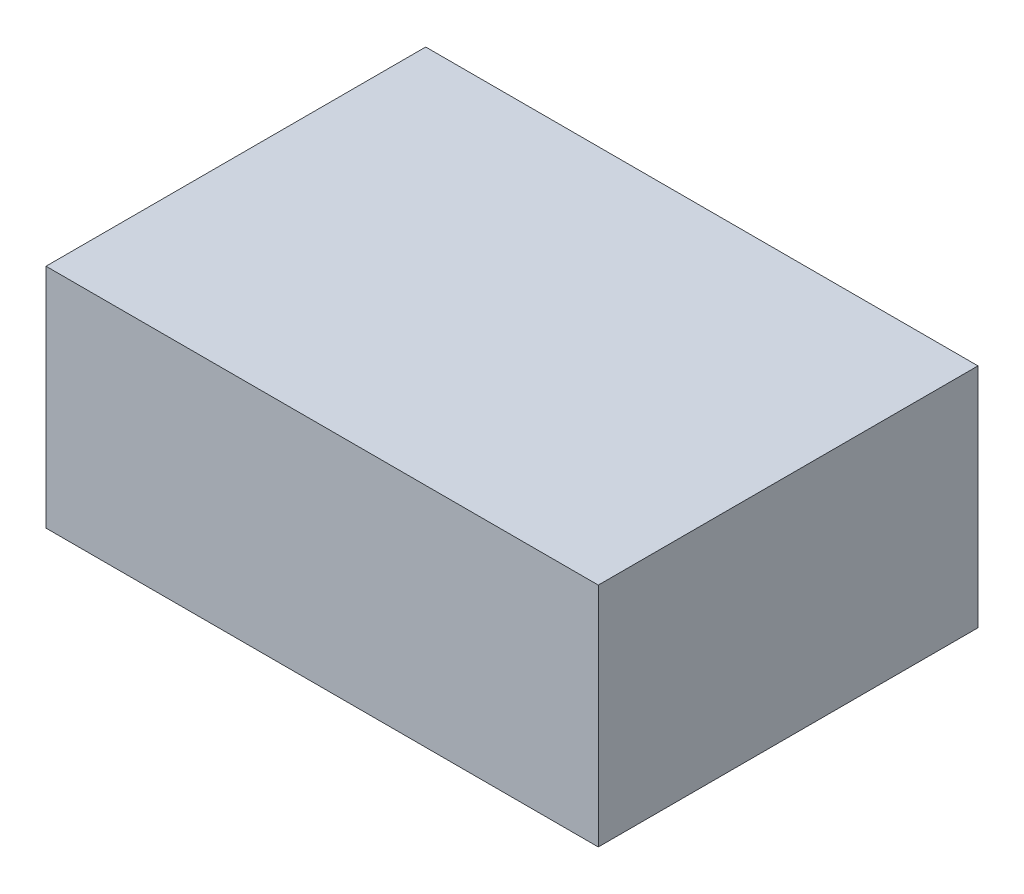
ISO-10303-21;
HEADER;
FILE_DESCRIPTION(('STEP AP214'),'2;1');
FILE_NAME('part.step','',(''),(''),'','','');
FILE_SCHEMA(('AUTOMOTIVE_DESIGN { 1 0 10303 214 1 1 1 1 }'));
ENDSEC;
DATA;
#1=APPLICATION_CONTEXT('core data for automotive mechanical design processes');
#2=APPLICATION_PROTOCOL_DEFINITION('international standard','automotive_design',2000,#1);
#3=PRODUCT_CONTEXT('',#1,'mechanical');
#4=PRODUCT('Part','Part','',(#3));
#5=PRODUCT_RELATED_PRODUCT_CATEGORY('part','',(#4));
#6=PRODUCT_DEFINITION_FORMATION('','',#4);
#7=PRODUCT_DEFINITION_CONTEXT('part definition',#1,'design');
#8=PRODUCT_DEFINITION('design','',#6,#7);
#9=PRODUCT_DEFINITION_SHAPE('','',#8);
#10=(LENGTH_UNIT() NAMED_UNIT(*) SI_UNIT(.MILLI.,.METRE.));
#11=(NAMED_UNIT(*) PLANE_ANGLE_UNIT() SI_UNIT($,.RADIAN.));
#12=(NAMED_UNIT(*) SI_UNIT($,.STERADIAN.) SOLID_ANGLE_UNIT());
#13=UNCERTAINTY_MEASURE_WITH_UNIT(LENGTH_MEASURE(1.E-05),#10,'distance_accuracy_value','');
#14=(GEOMETRIC_REPRESENTATION_CONTEXT(3) GLOBAL_UNCERTAINTY_ASSIGNED_CONTEXT((#13)) GLOBAL_UNIT_ASSIGNED_CONTEXT((#10,
#11,#12)) REPRESENTATION_CONTEXT('',''));
#15=CARTESIAN_POINT('',(0.,0.,0.));
#16=DIRECTION('',(0.,0.,1.));
#17=DIRECTION('',(1.,0.,0.));
#18=AXIS2_PLACEMENT_3D('',#15,#16,#17);
#19=CARTESIAN_POINT('',(1.17,0.22,-1.98078486941323));
#20=DIRECTION('',(0.,1.,0.));
#21=DIRECTION('',(0.,0.,1.));
#22=AXIS2_PLACEMENT_3D('',#19,#20,#21);
#23=PLANE('',#22);
#24=DIRECTION('',(1.,0.,0.));
#25=VECTOR('',#24,1.);
#26=CARTESIAN_POINT('',(1.17,0.22,-0.77));
#27=LINE('',#26,#25);
#28=CARTESIAN_POINT('',(0.0499999999999999,0.22,-0.77));
#29=VERTEX_POINT('',#28);
#30=CARTESIAN_POINT('',(1.17,0.22,-0.77));
#31=VERTEX_POINT('',#30);
#32=EDGE_CURVE('E41',#29,#31,#27,.T.);
#33=ORIENTED_EDGE('',*,*,#32,.F.);
#34=DIRECTION('',(0.,0.,1.));
#35=VECTOR('',#34,1.);
#36=CARTESIAN_POINT('',(0.0499999999999999,0.22,-1.98078486941323));
#37=LINE('',#36,#35);
#38=CARTESIAN_POINT('',(0.0499999999999999,0.22,0.));
#39=VERTEX_POINT('',#38);
#40=EDGE_CURVE('E69',#29,#39,#37,.T.);
#41=ORIENTED_EDGE('',*,*,#40,.T.);
#42=DIRECTION('',(-1.,0.,0.));
#43=VECTOR('',#42,1.);
#44=CARTESIAN_POINT('',(1.17,0.22,0.));
#45=LINE('',#44,#43);
#46=CARTESIAN_POINT('',(1.17,0.22,0.));
#47=VERTEX_POINT('',#46);
#48=EDGE_CURVE('E73',#47,#39,#45,.T.);
#49=ORIENTED_EDGE('',*,*,#48,.F.);
#50=DIRECTION('',(0.,0.,1.));
#51=VECTOR('',#50,1.);
#52=CARTESIAN_POINT('',(1.17,0.22,-1.98078486941323));
#53=LINE('',#52,#51);
#54=EDGE_CURVE('E96',#31,#47,#53,.T.);
#55=ORIENTED_EDGE('',*,*,#54,.F.);
#56=EDGE_LOOP('',(#33,#41,#49,#55));
#57=FACE_BOUND('',#56,.T.);
#58=ADVANCED_FACE('F33',(#57),#23,.T.);
#59=CARTESIAN_POINT('',(1.17,-0.24,-1.98078486941323));
#60=DIRECTION('',(1.,0.,0.));
#61=DIRECTION('',(0.,0.,-1.));
#62=AXIS2_PLACEMENT_3D('',#59,#60,#61);
#63=PLANE('',#62);
#64=DIRECTION('',(0.,-1.,0.));
#65=VECTOR('',#64,1.);
#66=CARTESIAN_POINT('',(1.17,-0.24,-0.77));
#67=LINE('',#66,#65);
#68=CARTESIAN_POINT('',(1.17,-0.24,-0.77));
#69=VERTEX_POINT('',#68);
#70=EDGE_CURVE('E47',#31,#69,#67,.T.);
#71=ORIENTED_EDGE('',*,*,#70,.F.);
#72=ORIENTED_EDGE('',*,*,#54,.T.);
#73=DIRECTION('',(0.,1.,0.));
#74=VECTOR('',#73,1.);
#75=CARTESIAN_POINT('',(1.17,-0.24,0.));
#76=LINE('',#75,#74);
#77=CARTESIAN_POINT('',(1.17,-0.24,0.));
#78=VERTEX_POINT('',#77);
#79=EDGE_CURVE('E78',#78,#47,#76,.T.);
#80=ORIENTED_EDGE('',*,*,#79,.F.);
#81=DIRECTION('',(0.,0.,1.));
#82=VECTOR('',#81,1.);
#83=CARTESIAN_POINT('',(1.17,-0.24,-1.98078486941323));
#84=LINE('',#83,#82);
#85=EDGE_CURVE('E99',#69,#78,#84,.T.);
#86=ORIENTED_EDGE('',*,*,#85,.F.);
#87=EDGE_LOOP('',(#71,#72,#80,#86));
#88=FACE_BOUND('',#87,.T.);
#89=ADVANCED_FACE('F105',(#88),#63,.T.);
#90=CARTESIAN_POINT('',(0.0499999999999999,-0.24,-1.98078486941323));
#91=DIRECTION('',(0.,-1.,0.));
#92=DIRECTION('',(0.,0.,-1.));
#93=AXIS2_PLACEMENT_3D('',#90,#91,#92);
#94=PLANE('',#93);
#95=DIRECTION('',(-1.,0.,0.));
#96=VECTOR('',#95,1.);
#97=CARTESIAN_POINT('',(0.0499999999999999,-0.24,-0.77));
#98=LINE('',#97,#96);
#99=CARTESIAN_POINT('',(0.0499999999999999,-0.24,-0.77));
#100=VERTEX_POINT('',#99);
#101=EDGE_CURVE('E98',#69,#100,#98,.T.);
#102=ORIENTED_EDGE('',*,*,#101,.F.);
#103=ORIENTED_EDGE('',*,*,#85,.T.);
#104=DIRECTION('',(1.,0.,0.));
#105=VECTOR('',#104,1.);
#106=CARTESIAN_POINT('',(0.0499999999999999,-0.24,0.));
#107=LINE('',#106,#105);
#108=CARTESIAN_POINT('',(0.0499999999999999,-0.24,0.));
#109=VERTEX_POINT('',#108);
#110=EDGE_CURVE('E86',#109,#78,#107,.T.);
#111=ORIENTED_EDGE('',*,*,#110,.F.);
#112=DIRECTION('',(0.,0.,1.));
#113=VECTOR('',#112,1.);
#114=CARTESIAN_POINT('',(0.0499999999999999,-0.24,-1.98078486941323));
#115=LINE('',#114,#113);
#116=EDGE_CURVE('E77',#100,#109,#115,.T.);
#117=ORIENTED_EDGE('',*,*,#116,.F.);
#118=EDGE_LOOP('',(#102,#103,#111,#117));
#119=FACE_BOUND('',#118,.T.);
#120=ADVANCED_FACE('F103',(#119),#94,.T.);
#121=CARTESIAN_POINT('',(0.0499999999999999,0.22,-1.98078486941323));
#122=DIRECTION('',(-1.,0.,0.));
#123=DIRECTION('',(0.,0.,1.));
#124=AXIS2_PLACEMENT_3D('',#121,#122,#123);
#125=PLANE('',#124);
#126=DIRECTION('',(0.,1.,0.));
#127=VECTOR('',#126,1.);
#128=CARTESIAN_POINT('',(0.0499999999999999,0.22,-0.77));
#129=LINE('',#128,#127);
#130=EDGE_CURVE('E11',#100,#29,#129,.T.);
#131=ORIENTED_EDGE('',*,*,#130,.F.);
#132=ORIENTED_EDGE('',*,*,#116,.T.);
#133=DIRECTION('',(0.,-1.,0.));
#134=VECTOR('',#133,1.);
#135=CARTESIAN_POINT('',(0.0499999999999999,0.22,0.));
#136=LINE('',#135,#134);
#137=EDGE_CURVE('E80',#39,#109,#136,.T.);
#138=ORIENTED_EDGE('',*,*,#137,.F.);
#139=ORIENTED_EDGE('',*,*,#40,.F.);
#140=EDGE_LOOP('',(#131,#132,#138,#139));
#141=FACE_BOUND('',#140,.T.);
#142=ADVANCED_FACE('F81',(#141),#125,.T.);
#143=CARTESIAN_POINT('',(0.,0.,0.));
#144=DIRECTION('',(0.,0.,1.));
#145=DIRECTION('',(1.,0.,0.));
#146=AXIS2_PLACEMENT_3D('',#143,#144,#145);
#147=PLANE('',#146);
#148=ORIENTED_EDGE('',*,*,#48,.T.);
#149=ORIENTED_EDGE('',*,*,#137,.T.);
#150=ORIENTED_EDGE('',*,*,#110,.T.);
#151=ORIENTED_EDGE('',*,*,#79,.T.);
#152=EDGE_LOOP('',(#148,#149,#150,#151));
#153=FACE_BOUND('',#152,.T.);
#154=ADVANCED_FACE('F88',(#153),#147,.T.);
#155=CARTESIAN_POINT('',(0.03,-0.22,-0.77));
#156=DIRECTION('',(0.,0.,1.));
#157=DIRECTION('',(0.,-1.,0.));
#158=AXIS2_PLACEMENT_3D('',#155,#156,#157);
#159=PLANE('',#158);
#160=ORIENTED_EDGE('',*,*,#32,.T.);
#161=ORIENTED_EDGE('',*,*,#70,.T.);
#162=ORIENTED_EDGE('',*,*,#101,.T.);
#163=ORIENTED_EDGE('',*,*,#130,.T.);
#164=EDGE_LOOP('',(#160,#161,#162,#163));
#165=FACE_BOUND('',#164,.T.);
#166=ADVANCED_FACE('F107',(#165),#159,.F.);
#167=CLOSED_SHELL('',(#58,#89,#120,#142,#154,#166));
#168=MANIFOLD_SOLID_BREP('B2',#167);
#169=ADVANCED_BREP_SHAPE_REPRESENTATION('',(#18,#168),#14);
#170=SHAPE_DEFINITION_REPRESENTATION(#9,#169);
ENDSEC;
END-ISO-10303-21;
